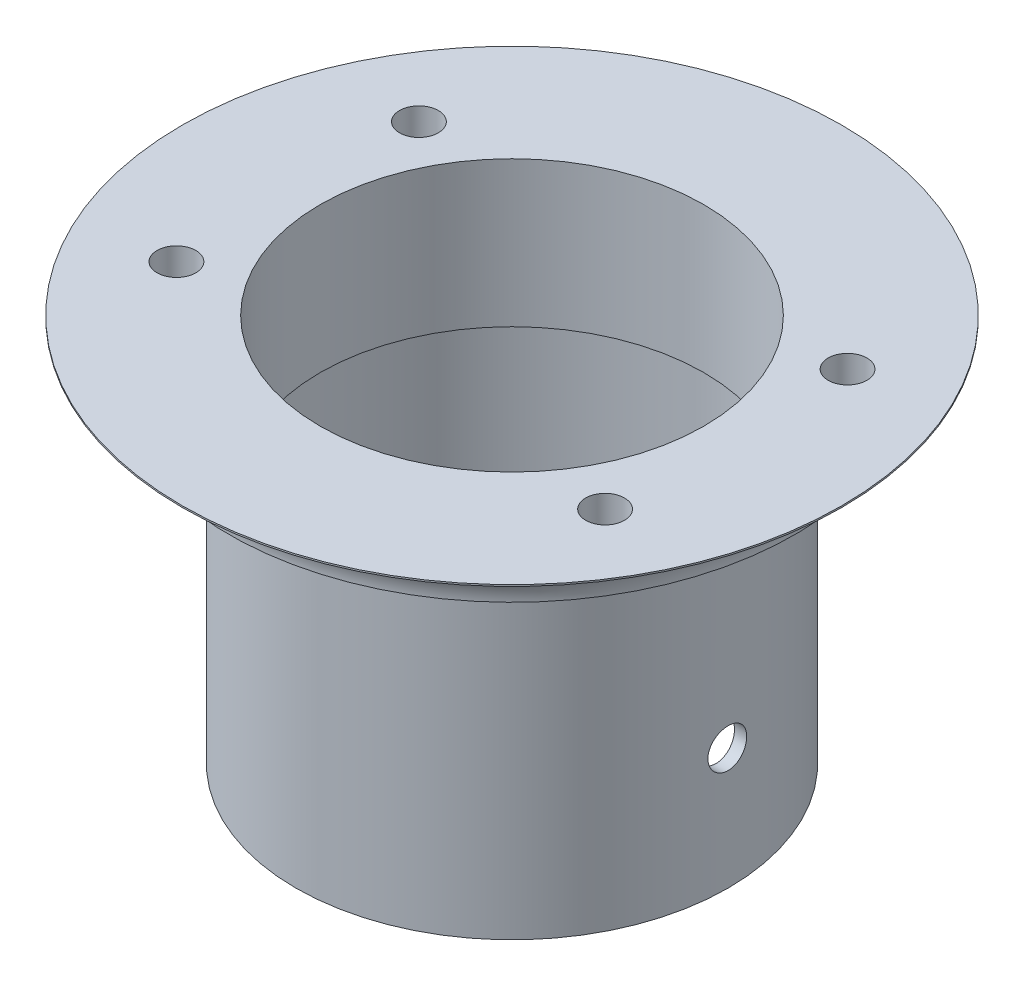
ISO-10303-21;
HEADER;
FILE_DESCRIPTION(('STEP AP214'),'2;1');
FILE_NAME('part.step','',(''),(''),'','','');
FILE_SCHEMA(('AUTOMOTIVE_DESIGN { 1 0 10303 214 1 1 1 1 }'));
ENDSEC;
DATA;
#1=APPLICATION_CONTEXT('core data for automotive mechanical design processes');
#2=APPLICATION_PROTOCOL_DEFINITION('international standard','automotive_design',2000,#1);
#3=PRODUCT_CONTEXT('',#1,'mechanical');
#4=PRODUCT('Part','Part','',(#3));
#5=PRODUCT_RELATED_PRODUCT_CATEGORY('part','',(#4));
#6=PRODUCT_DEFINITION_FORMATION('','',#4);
#7=PRODUCT_DEFINITION_CONTEXT('part definition',#1,'design');
#8=PRODUCT_DEFINITION('design','',#6,#7);
#9=PRODUCT_DEFINITION_SHAPE('','',#8);
#10=(LENGTH_UNIT() NAMED_UNIT(*) SI_UNIT(.MILLI.,.METRE.));
#11=(NAMED_UNIT(*) PLANE_ANGLE_UNIT() SI_UNIT($,.RADIAN.));
#12=(NAMED_UNIT(*) SI_UNIT($,.STERADIAN.) SOLID_ANGLE_UNIT());
#13=UNCERTAINTY_MEASURE_WITH_UNIT(LENGTH_MEASURE(1.E-05),#10,'distance_accuracy_value','');
#14=(GEOMETRIC_REPRESENTATION_CONTEXT(3) GLOBAL_UNCERTAINTY_ASSIGNED_CONTEXT((#13)) GLOBAL_UNIT_ASSIGNED_CONTEXT((#10,
#11,#12)) REPRESENTATION_CONTEXT('',''));
#15=CARTESIAN_POINT('',(0.,0.,0.));
#16=DIRECTION('',(0.,0.,1.));
#17=DIRECTION('',(1.,0.,0.));
#18=AXIS2_PLACEMENT_3D('',#15,#16,#17);
#19=CARTESIAN_POINT('',(0.,-30.,0.));
#20=DIRECTION('',(0.,1.,0.));
#21=DIRECTION('',(0.,0.,1.));
#22=AXIS2_PLACEMENT_3D('',#19,#20,#21);
#23=CYLINDRICAL_SURFACE('',#22,22.2871926);
#24=CARTESIAN_POINT('',(0.,-30.,0.));
#25=DIRECTION('',(0.,-1.,0.));
#26=DIRECTION('',(0.,0.,-1.));
#27=AXIS2_PLACEMENT_3D('',#24,#25,#26);
#28=CIRCLE('',#27,22.2871926);
#29=CARTESIAN_POINT('',(0.,-30.,-22.2871926));
#30=VERTEX_POINT('',#29);
#31=EDGE_CURVE('E180',#30,#30,#28,.T.);
#32=ORIENTED_EDGE('',*,*,#31,.F.);
#33=EDGE_LOOP('',(#32));
#34=FACE_BOUND('',#33,.T.);
#35=CARTESIAN_POINT('',(0.,5.,0.));
#36=DIRECTION('',(0.,-1.,0.));
#37=DIRECTION('',(0.,0.,-1.));
#38=AXIS2_PLACEMENT_3D('',#35,#36,#37);
#39=CIRCLE('',#38,22.2871926);
#40=CARTESIAN_POINT('',(0.,5.,-22.2871926));
#41=VERTEX_POINT('',#40);
#42=EDGE_CURVE('E178',#41,#41,#39,.T.);
#43=ORIENTED_EDGE('',*,*,#42,.T.);
#44=EDGE_LOOP('',(#43));
#45=FACE_BOUND('',#44,.T.);
#46=CARTESIAN_POINT('',(-22.1972735710829,-17.5,2.));
#47=CARTESIAN_POINT('',(-22.1972747578384,-17.3879020512167,1.99999511742206));
#48=CARTESIAN_POINT('',(-22.1981318713445,-17.2757285837097,1.990543818689));
#49=CARTESIAN_POINT('',(-22.2014675221558,-17.0544876457277,1.95298122193684));
#50=CARTESIAN_POINT('',(-22.2039478783657,-16.9454238029419,1.92484899070827));
#51=CARTESIAN_POINT('',(-22.210246844414,-16.7336383045393,1.85074673635096));
#52=CARTESIAN_POINT('',(-22.2140646763531,-16.6309130030744,1.80478708030251));
#53=CARTESIAN_POINT('',(-22.2226074531708,-16.4346584040803,1.69635359363768));
#54=CARTESIAN_POINT('',(-22.2273322090682,-16.3411271968517,1.63388320244132));
#55=CARTESIAN_POINT('',(-22.2371721337219,-16.1656157733296,1.49400257964118));
#56=CARTESIAN_POINT('',(-22.2422882941835,-16.0836665040397,1.41655358427252));
#57=CARTESIAN_POINT('',(-22.2523255157385,-15.9339113047724,1.24899661663564));
#58=CARTESIAN_POINT('',(-22.2572465681556,-15.8661060031876,1.15888808222299));
#59=CARTESIAN_POINT('',(-22.2663486688275,-15.7464588426304,0.968383200456268));
#60=CARTESIAN_POINT('',(-22.2705284588251,-15.6946440184637,0.867969808575251));
#61=CARTESIAN_POINT('',(-22.2776663557045,-15.6086215750189,0.659824263836168));
#62=CARTESIAN_POINT('',(-22.2806244870105,-15.5744136037322,0.552092257345804));
#63=CARTESIAN_POINT('',(-22.2849788219677,-15.5246656964799,0.332677649173628));
#64=CARTESIAN_POINT('',(-22.2863792415886,-15.5090753631355,0.221006559086607));
#65=CARTESIAN_POINT('',(-22.2874746715091,-15.4968494362648,-0.00337546761511194));
#66=CARTESIAN_POINT('',(-22.287169718065,-15.5002134397689,-0.116086382072265));
#67=CARTESIAN_POINT('',(-22.2848922298026,-15.5257595912184,-0.339006741680385));
#68=CARTESIAN_POINT('',(-22.2829244974277,-15.5478875457025,-0.449222453174857));
#69=CARTESIAN_POINT('',(-22.2775482296399,-15.610249143337,-0.664369168517822));
#70=CARTESIAN_POINT('',(-22.2741396786775,-15.6504829818884,-0.769300115318883));
#71=CARTESIAN_POINT('',(-22.2662568836501,-15.7479743009695,-0.971070558621091));
#72=CARTESIAN_POINT('',(-22.2617811285953,-15.8052559472581,-1.06789831730319));
#73=CARTESIAN_POINT('',(-22.252266629674,-15.9351993205307,-1.25058570005471));
#74=CARTESIAN_POINT('',(-22.2472278725395,-16.007861410018,-1.33644506553247));
#75=CARTESIAN_POINT('',(-22.2371323841951,-16.1668082616334,-1.49507549578169));
#76=CARTESIAN_POINT('',(-22.2320756522269,-16.2531401337092,-1.56779936485415));
#77=CARTESIAN_POINT('',(-22.2225319486924,-16.4368120352031,-1.69772953841518));
#78=CARTESIAN_POINT('',(-22.2180449777122,-16.534152075942,-1.75493582694544));
#79=CARTESIAN_POINT('',(-22.2101481626183,-16.7371114626717,-1.8522057349068));
#80=CARTESIAN_POINT('',(-22.2067384830431,-16.8427320703104,-1.89226673600946));
#81=CARTESIAN_POINT('',(-22.2013856168003,-17.0592378347672,-1.95407307096022));
#82=CARTESIAN_POINT('',(-22.1994423943012,-17.1701228628838,-1.9758188523247));
#83=CARTESIAN_POINT('',(-22.1972484360612,-17.3935963785479,-2.00031736919359));
#84=CARTESIAN_POINT('',(-22.1969918287129,-17.5061775873995,-2.0031359964759));
#85=CARTESIAN_POINT('',(-22.1981846600312,-17.7302108347709,-1.98987295841871));
#86=CARTESIAN_POINT('',(-22.1996340802026,-17.8416628855188,-1.97379149797679));
#87=CARTESIAN_POINT('',(-22.2040703057082,-18.0600838864496,-1.92323978146857));
#88=CARTESIAN_POINT('',(-22.2070545275864,-18.1670600445093,-1.8888004228082));
#89=CARTESIAN_POINT('',(-22.2142219880295,-18.373716157008,-1.80254197486507));
#90=CARTESIAN_POINT('',(-22.2184052488387,-18.4733959760435,-1.75072256314742));
#91=CARTESIAN_POINT('',(-22.2275136706671,-18.6629309614522,-1.63100884413622));
#92=CARTESIAN_POINT('',(-22.2324408405437,-18.7527583523376,-1.56307071688197));
#93=CARTESIAN_POINT('',(-22.2424752044135,-18.9197575483548,-1.41311119297579));
#94=CARTESIAN_POINT('',(-22.2475824019941,-18.9969291011184,-1.3310895155527));
#95=CARTESIAN_POINT('',(-22.2574189441875,-19.1366517562085,-1.15500604030694));
#96=CARTESIAN_POINT('',(-22.2621471547689,-19.1991599837973,-1.06091014917612));
#97=CARTESIAN_POINT('',(-22.2706765810179,-19.3074871213661,-0.863518617980246));
#98=CARTESIAN_POINT('',(-22.274477807211,-19.3533062208453,-0.760223082390513));
#99=CARTESIAN_POINT('',(-22.2807197891287,-19.426881190768,-0.547516632091038));
#100=CARTESIAN_POINT('',(-22.2831625240799,-19.4546633497061,-0.438114870976029));
#101=CARTESIAN_POINT('',(-22.2864203628508,-19.4914616807736,-0.216176534935299));
#102=CARTESIAN_POINT('',(-22.2872355028901,-19.5004782705009,-0.103640029824807));
#103=CARTESIAN_POINT('',(-22.2871463372315,-19.4994842888056,0.120951224744838));
#104=CARTESIAN_POINT('',(-22.2862480611426,-19.48954044029,0.233006277913691));
#105=CARTESIAN_POINT('',(-22.2828449011884,-19.4510472730307,0.45384776307801));
#106=CARTESIAN_POINT('',(-22.2803400154438,-19.4224979325236,0.562634191249939));
#107=CARTESIAN_POINT('',(-22.274004533651,-19.3476217264594,0.773852904445489));
#108=CARTESIAN_POINT('',(-22.2701740481596,-19.3012963434146,0.876285718529785));
#109=CARTESIAN_POINT('',(-22.2616153388955,-19.1921904605281,1.07193140249992));
#110=CARTESIAN_POINT('',(-22.256887126052,-19.129410161012,1.16514438461093));
#111=CARTESIAN_POINT('',(-22.2470434449778,-18.9889259780871,1.34004620070505));
#112=CARTESIAN_POINT('',(-22.2419267265873,-18.9111725638661,1.42169518049074));
#113=CARTESIAN_POINT('',(-22.2318933661685,-18.7430425132889,1.57081920110572));
#114=CARTESIAN_POINT('',(-22.2269767727254,-18.6526628349345,1.63829081639756));
#115=CARTESIAN_POINT('',(-22.2178891383573,-18.4616431759549,1.75725187507409));
#116=CARTESIAN_POINT('',(-22.2137196945828,-18.3609819208149,1.80870725014414));
#117=CARTESIAN_POINT('',(-22.2066177291929,-18.1524779785493,1.89391873429749));
#118=CARTESIAN_POINT('',(-22.2036837959954,-18.0446436507977,1.92769505264626));
#119=CARTESIAN_POINT('',(-22.200134296723,-17.8634851937361,1.96805217594431));
#120=CARTESIAN_POINT('',(-22.1990665072282,-17.7913237712847,1.98001652304328));
#121=CARTESIAN_POINT('',(-22.1976357587225,-17.6461189281544,1.99599201375689));
#122=CARTESIAN_POINT('',(-22.197272797449,-17.5730755103078,2.00000318290279));
#123=CARTESIAN_POINT('',(-22.1972735710829,-17.5,2.));
#124=B_SPLINE_CURVE_WITH_KNOTS('',3,(#46,#47,#48,#49,#50,#51,#52,#53,#54,#55,#56,#57,#58,#59,
#60,#61,#62,#63,#64,#65,#66,#67,#68,#69,#70,#71,#72,#73,#74,#75,#76,#77,#78,#79,#80,#81,#82,#83,
#84,#85,#86,#87,#88,#89,#90,#91,#92,#93,#94,#95,#96,#97,#98,#99,#100,#101,#102,#103,#104,#105,
#106,#107,#108,#109,#110,#111,#112,#113,#114,#115,#116,#117,#118,#119,#120,#121,#122,#123),
.UNSPECIFIED.,.T.,.F.,(4,2,2,2,2,2,2,2,2,2,2,2,2,2,2,2,2,2,2,2,2,2,2,2,2,2,2,2,2,2,2,2,2,2,2,2,
2,2,4),(0.,0.336027017428784,0.672431212005177,1.0086400719516,1.34477894995673,
1.68179966672602,2.01883535356938,2.35643777760467,2.69403345178983,3.03071317808978,
3.36738574659989,3.70308924674595,4.03879636993308,4.37498165278979,4.71117486011394,
5.04855296639092,5.38593141962668,5.72336137696629,6.06078308926081,6.39702951152464,
6.73327228854404,7.06895092809568,7.40463579550451,7.74124392135057,8.07785875863146,
8.41544590096337,8.75302920999183,9.09011938664503,9.42720206181135,9.76310071191314,
10.0989997549234,10.4348707902195,10.7707377367398,11.1077354274279,11.4448144501676,
11.7826056533358,12.1200098729808,12.3390631640554,12.5581157519247),.UNSPECIFIED.);
#125=CARTESIAN_POINT('',(-22.1972735710829,-17.5,2.));
#126=VERTEX_POINT('',#125);
#127=EDGE_CURVE('E93',#126,#126,#124,.T.);
#128=ORIENTED_EDGE('',*,*,#127,.F.);
#129=EDGE_LOOP('',(#128));
#130=FACE_BOUND('',#129,.T.);
#131=CARTESIAN_POINT('',(22.1972735710829,-17.5,2.));
#132=CARTESIAN_POINT('',(22.1972747578384,-17.6120979487833,1.99999511742206));
#133=CARTESIAN_POINT('',(22.1981318713445,-17.7242714162903,1.990543818689));
#134=CARTESIAN_POINT('',(22.2014675221558,-17.9455123542723,1.95298122193684));
#135=CARTESIAN_POINT('',(22.2039478783657,-18.0545761970581,1.92484899070827));
#136=CARTESIAN_POINT('',(22.210246844414,-18.2663616954607,1.85074673635096));
#137=CARTESIAN_POINT('',(22.2140646763531,-18.3690869969256,1.80478708030251));
#138=CARTESIAN_POINT('',(22.2226074531708,-18.5653415959197,1.69635359363768));
#139=CARTESIAN_POINT('',(22.2273322090682,-18.6588728031483,1.63388320244132));
#140=CARTESIAN_POINT('',(22.2371721337219,-18.8343842266704,1.49400257964118));
#141=CARTESIAN_POINT('',(22.2422882941835,-18.9163334959603,1.41655358427252));
#142=CARTESIAN_POINT('',(22.2523255157385,-19.0660886952276,1.24899661663564));
#143=CARTESIAN_POINT('',(22.2572465681556,-19.1338939968124,1.15888808222299));
#144=CARTESIAN_POINT('',(22.2663486688275,-19.2535411573696,0.968383200456268));
#145=CARTESIAN_POINT('',(22.2705284588251,-19.3053559815363,0.867969808575251));
#146=CARTESIAN_POINT('',(22.2776663557045,-19.3913784249811,0.659824263836168));
#147=CARTESIAN_POINT('',(22.2806244870105,-19.4255863962679,0.552092257345804));
#148=CARTESIAN_POINT('',(22.2849788219677,-19.4753343035201,0.332677649173627));
#149=CARTESIAN_POINT('',(22.2863792415886,-19.4909246368645,0.221006559086607));
#150=CARTESIAN_POINT('',(22.2874746715091,-19.5031505637352,-0.00337546761511175));
#151=CARTESIAN_POINT('',(22.287169718065,-19.4997865602311,-0.116086382072265));
#152=CARTESIAN_POINT('',(22.2848922298026,-19.4742404087816,-0.339006741680384));
#153=CARTESIAN_POINT('',(22.2829244974277,-19.4521124542975,-0.449222453174857));
#154=CARTESIAN_POINT('',(22.2775482296399,-19.389750856663,-0.664369168517822));
#155=CARTESIAN_POINT('',(22.2741396786775,-19.3495170181116,-0.769300115318883));
#156=CARTESIAN_POINT('',(22.2662568836501,-19.2520256990305,-0.971070558621091));
#157=CARTESIAN_POINT('',(22.2617811285953,-19.1947440527419,-1.06789831730319));
#158=CARTESIAN_POINT('',(22.252266629674,-19.0648006794693,-1.25058570005471));
#159=CARTESIAN_POINT('',(22.2472278725395,-18.992138589982,-1.33644506553247));
#160=CARTESIAN_POINT('',(22.2371323841951,-18.8331917383666,-1.49507549578169));
#161=CARTESIAN_POINT('',(22.2320756522269,-18.7468598662908,-1.56779936485415));
#162=CARTESIAN_POINT('',(22.2225319486924,-18.5631879647969,-1.69772953841518));
#163=CARTESIAN_POINT('',(22.2180449777122,-18.465847924058,-1.75493582694544));
#164=CARTESIAN_POINT('',(22.2101481626183,-18.2628885373283,-1.8522057349068));
#165=CARTESIAN_POINT('',(22.2067384830431,-18.1572679296896,-1.89226673600946));
#166=CARTESIAN_POINT('',(22.2013856168003,-17.9407621652328,-1.95407307096022));
#167=CARTESIAN_POINT('',(22.1994423943012,-17.8298771371162,-1.9758188523247));
#168=CARTESIAN_POINT('',(22.1972484360612,-17.6064036214521,-2.00031736919359));
#169=CARTESIAN_POINT('',(22.1969918287129,-17.4938224126005,-2.0031359964759));
#170=CARTESIAN_POINT('',(22.1981846600312,-17.2697891652291,-1.98987295841871));
#171=CARTESIAN_POINT('',(22.1996340802026,-17.1583371144812,-1.97379149797679));
#172=CARTESIAN_POINT('',(22.2040703057082,-16.9399161135504,-1.92323978146857));
#173=CARTESIAN_POINT('',(22.2070545275864,-16.8329399554907,-1.8888004228082));
#174=CARTESIAN_POINT('',(22.2142219880295,-16.626283842992,-1.80254197486507));
#175=CARTESIAN_POINT('',(22.2184052488387,-16.5266040239565,-1.75072256314742));
#176=CARTESIAN_POINT('',(22.2275136706671,-16.3370690385478,-1.63100884413621));
#177=CARTESIAN_POINT('',(22.2324408405437,-16.2472416476624,-1.56307071688197));
#178=CARTESIAN_POINT('',(22.2424752044135,-16.0802424516452,-1.41311119297579));
#179=CARTESIAN_POINT('',(22.2475824019941,-16.0030708988816,-1.3310895155527));
#180=CARTESIAN_POINT('',(22.2574189441875,-15.8633482437915,-1.15500604030694));
#181=CARTESIAN_POINT('',(22.2621471547689,-15.8008400162027,-1.06091014917612));
#182=CARTESIAN_POINT('',(22.2706765810179,-15.6925128786339,-0.863518617980248));
#183=CARTESIAN_POINT('',(22.274477807211,-15.6466937791547,-0.760223082390515));
#184=CARTESIAN_POINT('',(22.2807197891287,-15.573118809232,-0.54751663209104));
#185=CARTESIAN_POINT('',(22.2831625240799,-15.5453366502939,-0.43811487097603));
#186=CARTESIAN_POINT('',(22.2864203628508,-15.5085383192264,-0.2161765349353));
#187=CARTESIAN_POINT('',(22.2872355028901,-15.4995217294991,-0.103640029824807));
#188=CARTESIAN_POINT('',(22.2871463372315,-15.5005157111944,0.120951224744839));
#189=CARTESIAN_POINT('',(22.2862480611426,-15.51045955971,0.233006277913691));
#190=CARTESIAN_POINT('',(22.2828449011884,-15.5489527269693,0.45384776307801));
#191=CARTESIAN_POINT('',(22.2803400154438,-15.5775020674764,0.56263419124994));
#192=CARTESIAN_POINT('',(22.274004533651,-15.6523782735406,0.773852904445491));
#193=CARTESIAN_POINT('',(22.2701740481596,-15.6987036565854,0.876285718529788));
#194=CARTESIAN_POINT('',(22.2616153388955,-15.8078095394719,1.07193140249992));
#195=CARTESIAN_POINT('',(22.256887126052,-15.870589838988,1.16514438461093));
#196=CARTESIAN_POINT('',(22.2470434449778,-16.0110740219129,1.34004620070505));
#197=CARTESIAN_POINT('',(22.2419267265873,-16.0888274361339,1.42169518049073));
#198=CARTESIAN_POINT('',(22.2318933661685,-16.2569574867111,1.57081920110572));
#199=CARTESIAN_POINT('',(22.2269767727254,-16.3473371650655,1.63829081639756));
#200=CARTESIAN_POINT('',(22.2178891383573,-16.5383568240451,1.75725187507409));
#201=CARTESIAN_POINT('',(22.2137196945828,-16.6390180791851,1.80870725014414));
#202=CARTESIAN_POINT('',(22.2066177291929,-16.8475220214507,1.89391873429749));
#203=CARTESIAN_POINT('',(22.2036837959954,-16.9553563492023,1.92769505264626));
#204=CARTESIAN_POINT('',(22.200134296723,-17.1365148062639,1.96805217594431));
#205=CARTESIAN_POINT('',(22.1990665072282,-17.2086762287153,1.98001652304328));
#206=CARTESIAN_POINT('',(22.1976357587225,-17.3538810718456,1.99599201375689));
#207=CARTESIAN_POINT('',(22.197272797449,-17.4269244896922,2.00000318290279));
#208=CARTESIAN_POINT('',(22.1972735710829,-17.5,2.));
#209=B_SPLINE_CURVE_WITH_KNOTS('',3,(#131,#132,#133,#134,#135,#136,#137,#138,#139,#140,#141,
#142,#143,#144,#145,#146,#147,#148,#149,#150,#151,#152,#153,#154,#155,#156,#157,#158,#159,#160,
#161,#162,#163,#164,#165,#166,#167,#168,#169,#170,#171,#172,#173,#174,#175,#176,#177,#178,#179,
#180,#181,#182,#183,#184,#185,#186,#187,#188,#189,#190,#191,#192,#193,#194,#195,#196,#197,#198,
#199,#200,#201,#202,#203,#204,#205,#206,#207,#208),.UNSPECIFIED.,.T.,.F.,(4,2,2,2,2,2,2,2,2,2,2,
2,2,2,2,2,2,2,2,2,2,2,2,2,2,2,2,2,2,2,2,2,2,2,2,2,2,2,4),(0.,0.336027017428784,
0.672431212005177,1.0086400719516,1.34477894995673,1.68179966672602,2.01883535356938,
2.35643777760467,2.69403345178983,3.03071317808978,3.36738574659989,3.70308924674595,
4.03879636993308,4.37498165278979,4.71117486011394,5.04855296639092,5.38593141962668,
5.72336137696629,6.06078308926081,6.39702951152464,6.73327228854404,7.06895092809568,
7.40463579550451,7.74124392135057,8.07785875863146,8.41544590096337,8.75302920999183,
9.09011938664503,9.42720206181136,9.76310071191314,10.0989997549234,10.4348707902195,
10.7707377367398,11.1077354274279,11.4448144501676,11.7826056533358,12.1200098729808,
12.3390631640555,12.5581157519247),.UNSPECIFIED.);
#210=CARTESIAN_POINT('',(22.1972735710829,-17.5,2.));
#211=VERTEX_POINT('',#210);
#212=EDGE_CURVE('E100',#211,#211,#209,.T.);
#213=ORIENTED_EDGE('',*,*,#212,.F.);
#214=EDGE_LOOP('',(#213));
#215=FACE_BOUND('',#214,.T.);
#216=ADVANCED_FACE('F43',(#34,#45,#130,#215),#23,.T.);
#217=CARTESIAN_POINT('',(0.,-5.,0.));
#218=DIRECTION('',(0.,-1.,0.));
#219=DIRECTION('',(0.,0.,-1.));
#220=AXIS2_PLACEMENT_3D('',#217,#218,#219);
#221=CYLINDRICAL_SURFACE('',#220,21.0371926);
#222=CARTESIAN_POINT('',(0.,-5.,0.));
#223=DIRECTION('',(0.,-1.,0.));
#224=DIRECTION('',(0.,0.,-1.));
#225=AXIS2_PLACEMENT_3D('',#222,#223,#224);
#226=CIRCLE('',#225,21.0371926);
#227=CARTESIAN_POINT('',(0.,-5.,-21.0371926));
#228=VERTEX_POINT('',#227);
#229=EDGE_CURVE('E172',#228,#228,#226,.T.);
#230=ORIENTED_EDGE('',*,*,#229,.F.);
#231=EDGE_LOOP('',(#230));
#232=FACE_BOUND('',#231,.T.);
#233=CARTESIAN_POINT('',(0.,-30.,0.));
#234=DIRECTION('',(0.,-1.,0.));
#235=DIRECTION('',(0.,0.,-1.));
#236=AXIS2_PLACEMENT_3D('',#233,#234,#235);
#237=CIRCLE('',#236,21.0371926);
#238=CARTESIAN_POINT('',(0.,-30.,-21.0371926));
#239=VERTEX_POINT('',#238);
#240=EDGE_CURVE('E168',#239,#239,#237,.T.);
#241=ORIENTED_EDGE('',*,*,#240,.T.);
#242=EDGE_LOOP('',(#241));
#243=FACE_BOUND('',#242,.T.);
#244=CARTESIAN_POINT('',(-20.9419070881688,-17.5,2.));
#245=CARTESIAN_POINT('',(-20.9419083413363,-17.6120681851692,1.99999513201458));
#246=CARTESIAN_POINT('',(-20.9428163597082,-17.7242111611602,1.99054882838601));
#247=CARTESIAN_POINT('',(-20.9463499676321,-17.945389909875,1.95300723820345));
#248=CARTESIAN_POINT('',(-20.9489774667533,-18.0544220872463,1.92489121748735));
#249=CARTESIAN_POINT('',(-20.9556497833662,-18.2661440846311,1.85083454002998));
#250=CARTESIAN_POINT('',(-20.9596937590213,-18.3688376292584,1.80490446875215));
#251=CARTESIAN_POINT('',(-20.9687423332486,-18.5650349564377,1.69654334919544));
#252=CARTESIAN_POINT('',(-20.9737467363954,-18.6585406026769,1.63411565683704));
#253=CARTESIAN_POINT('',(-20.9841708053427,-18.8340393112503,1.49430974200621));
#254=CARTESIAN_POINT('',(-20.9895916457219,-18.9159978133087,1.4168882193762));
#255=CARTESIAN_POINT('',(-21.0002271079792,-19.0657783354441,1.24938464715165));
#256=CARTESIAN_POINT('',(-21.0054417205491,-19.1335997180128,1.15930202691602));
#257=CARTESIAN_POINT('',(-21.0150886553621,-19.2532990372019,0.96882317260842));
#258=CARTESIAN_POINT('',(-21.0195194791809,-19.3051465728206,0.868407751815735));
#259=CARTESIAN_POINT('',(-21.0270868551762,-19.3912319623651,0.660247122460795));
#260=CARTESIAN_POINT('',(-21.0302234360967,-19.4254702073817,0.552502076744866));
#261=CARTESIAN_POINT('',(-21.0348406839719,-19.4752642664909,0.333088507012158));
#262=CARTESIAN_POINT('',(-21.0363263611574,-19.4908766178924,0.221432920762996));
#263=CARTESIAN_POINT('',(-21.0374914281367,-19.503150598913,-0.0029229863359404));
#264=CARTESIAN_POINT('',(-21.0371708606019,-19.49981267622,-0.115623282442325));
#265=CARTESIAN_POINT('',(-21.0347636682501,-19.474326862005,-0.338485800052365));
#266=CARTESIAN_POINT('',(-21.0326827515386,-19.4522397657246,-0.448655044151482));
#267=CARTESIAN_POINT('',(-21.0269953428753,-19.3899772304994,-0.663715646732794));
#268=CARTESIAN_POINT('',(-21.0233888327512,-19.3498015760904,-0.768606942329427));
#269=CARTESIAN_POINT('',(-21.0150459731244,-19.2524353593934,-0.970326378206366));
#270=CARTESIAN_POINT('',(-21.010307832801,-19.1952177922147,-1.06714140666164));
#271=CARTESIAN_POINT('',(-21.0002336264524,-19.0654115543207,-1.24981700137036));
#272=CARTESIAN_POINT('',(-20.9948975445921,-18.9928224764821,-1.33567727738439));
#273=CARTESIAN_POINT('',(-20.9842016341831,-18.8339916104411,-1.4943619999207));
#274=CARTESIAN_POINT('',(-20.9788417951928,-18.7476969545077,-1.56713353968094));
#275=CARTESIAN_POINT('',(-20.9687235713229,-18.5640881151839,-1.69716574064731));
#276=CARTESIAN_POINT('',(-20.9639651871842,-18.4667739182192,-1.75442638274627));
#277=CARTESIAN_POINT('',(-20.9555880675547,-18.2638488352008,-1.85181055977301));
#278=CARTESIAN_POINT('',(-20.9519695385038,-18.158236450579,-1.89193099089337));
#279=CARTESIAN_POINT('',(-20.9462860480425,-17.9417322842461,-1.95385485629721));
#280=CARTESIAN_POINT('',(-20.9442210439408,-17.8308406476993,-1.97565879392502));
#281=CARTESIAN_POINT('',(-20.941885669953,-17.6073897741459,-2.000263022369));
#282=CARTESIAN_POINT('',(-20.9416083173673,-17.4948387488602,-2.00313725498146));
#283=CARTESIAN_POINT('',(-20.9428612226345,-17.2708566069534,-1.9899945151607));
#284=CARTESIAN_POINT('',(-20.9443914584512,-17.1594254766963,-1.97397777302668));
#285=CARTESIAN_POINT('',(-20.9490807654374,-16.9410607499501,-1.92356953450101));
#286=CARTESIAN_POINT('',(-20.9522367496572,-16.8341190437223,-1.88921285727139));
#287=CARTESIAN_POINT('',(-20.9598194337728,-16.6275170365796,-1.80313550801036));
#288=CARTESIAN_POINT('',(-20.9642461600532,-16.5278568869064,-1.75141447543752));
#289=CARTESIAN_POINT('',(-20.9738884617107,-16.33830952917,-1.63189076577129));
#290=CARTESIAN_POINT('',(-20.9791064268696,-16.2484533961032,-1.56403900397166));
#291=CARTESIAN_POINT('',(-20.9897353736042,-16.0813795479059,-1.41425042003071));
#292=CARTESIAN_POINT('',(-20.9951463594961,-16.0041621156109,-1.33231328276353));
#293=CARTESIAN_POINT('',(-21.0055726573487,-15.8643034173128,-1.15635945804997));
#294=CARTESIAN_POINT('',(-21.0105866265807,-15.8017103266793,-1.06230438731366));
#295=CARTESIAN_POINT('',(-21.0196344691152,-15.6932083061395,-0.864974681594338));
#296=CARTESIAN_POINT('',(-21.0236683547174,-15.6472991668523,-0.76170016233414));
#297=CARTESIAN_POINT('',(-21.0302954222428,-15.5735502183128,-0.549032710882787));
#298=CARTESIAN_POINT('',(-21.0328909405232,-15.5456810939977,-0.43965002034241));
#299=CARTESIAN_POINT('',(-21.036358385484,-15.5087075598462,-0.217731988173247));
#300=CARTESIAN_POINT('',(-21.0372303556203,-15.4996026769057,-0.105196726102971));
#301=CARTESIAN_POINT('',(-21.0371524633343,-15.500422367701,0.119358272151501));
#302=CARTESIAN_POINT('',(-21.036209769555,-15.510272063278,0.231378291704009));
#303=CARTESIAN_POINT('',(-21.032622620045,-15.548564572215,0.452164928779333));
#304=CARTESIAN_POINT('',(-21.0299781626406,-15.5770074038603,0.560931543102491));
#305=CARTESIAN_POINT('',(-21.0232839019727,-15.6516585723344,0.7721249751765));
#306=CARTESIAN_POINT('',(-21.0192342516889,-15.6978649753473,0.874552481620244));
#307=CARTESIAN_POINT('',(-21.0101815361042,-15.8067235324959,1.07020932911492));
#308=CARTESIAN_POINT('',(-21.0051784793486,-15.8693755392317,1.16343875259687));
#309=CARTESIAN_POINT('',(-20.9947561577702,-16.0096279002007,1.33843667428401));
#310=CARTESIAN_POINT('',(-20.989335389176,-16.0872839401451,1.42016045408163));
#311=CARTESIAN_POINT('',(-20.9787013696893,-16.2552323954589,1.56945165676847));
#312=CARTESIAN_POINT('',(-20.973488169047,-16.3455278470974,1.63701566839741));
#313=CARTESIAN_POINT('',(-20.9638465034378,-16.5364189215892,1.75619086826012));
#314=CARTESIAN_POINT('',(-20.9594198943952,-16.6370380437217,1.8077645359426));
#315=CARTESIAN_POINT('',(-20.9518748595645,-16.8454844514405,1.89321669469507));
#316=CARTESIAN_POINT('',(-20.9487549500505,-16.9533033995562,1.9271152661882));
#317=CARTESIAN_POINT('',(-20.9449682805242,-17.1347842200757,1.96774478678936));
#318=CARTESIAN_POINT('',(-20.9438257141166,-17.2072835705456,1.97982410417126));
#319=CARTESIAN_POINT('',(-20.9422947087958,-17.3531779139698,1.99595329067948));
#320=CARTESIAN_POINT('',(-20.9419062670932,-17.4265729036103,2.00000318950498));
#321=CARTESIAN_POINT('',(-20.9419070881688,-17.5,2.));
#322=B_SPLINE_CURVE_WITH_KNOTS('',3,(#244,#245,#246,#247,#248,#249,#250,#251,#252,#253,#254,
#255,#256,#257,#258,#259,#260,#261,#262,#263,#264,#265,#266,#267,#268,#269,#270,#271,#272,#273,
#274,#275,#276,#277,#278,#279,#280,#281,#282,#283,#284,#285,#286,#287,#288,#289,#290,#291,#292,
#293,#294,#295,#296,#297,#298,#299,#300,#301,#302,#303,#304,#305,#306,#307,#308,#309,#310,#311,
#312,#313,#314,#315,#316,#317,#318,#319,#320,#321),.UNSPECIFIED.,.T.,.F.,(4,2,2,2,2,2,2,2,2,2,2,
2,2,2,2,2,2,2,2,2,2,2,2,2,2,2,2,2,2,2,2,2,2,2,2,2,2,2,4),(0.,0.335936427677585,0.67224656407032,
1.00835716370642,1.34439944480395,1.68142704497219,2.01846983999266,2.35615017901219,
2.69382301804988,3.03046825077597,3.36710553050979,3.70265539642841,4.03820925940148,
4.37429770128889,4.71039504578437,5.04782182749956,5.3852490248734,5.72273729883339,
6.06021629818141,6.39637627648992,6.73253215672658,7.0680520885261,7.40357898725942,
7.74014024302407,8.07670902950457,8.41437137926937,8.75202949128174,9.08913752147559,
9.42623705203838,9.76200763801476,10.0977785542039,10.4335129273246,10.7692442914012,
11.1062464864328,11.4433297762989,11.7811981319475,12.1186817992274,12.3387882251211,
12.5588938368846),.UNSPECIFIED.);
#323=CARTESIAN_POINT('',(-20.9419070881688,-17.5,2.));
#324=VERTEX_POINT('',#323);
#325=EDGE_CURVE('E72',#324,#324,#322,.T.);
#326=ORIENTED_EDGE('',*,*,#325,.F.);
#327=EDGE_LOOP('',(#326));
#328=FACE_BOUND('',#327,.T.);
#329=CARTESIAN_POINT('',(20.9419070881688,-17.5,2.));
#330=CARTESIAN_POINT('',(20.9419083413363,-17.3879318148308,1.99999513201458));
#331=CARTESIAN_POINT('',(20.9428163597082,-17.2757888388398,1.99054882838601));
#332=CARTESIAN_POINT('',(20.9463499676321,-17.054610090125,1.95300723820345));
#333=CARTESIAN_POINT('',(20.9489774667533,-16.9455779127537,1.92489121748734));
#334=CARTESIAN_POINT('',(20.9556497833662,-16.7338559153689,1.85083454002998));
#335=CARTESIAN_POINT('',(20.9596937590213,-16.6311623707416,1.80490446875214));
#336=CARTESIAN_POINT('',(20.9687423332486,-16.4349650435623,1.69654334919543));
#337=CARTESIAN_POINT('',(20.9737467363954,-16.3414593973231,1.63411565683704));
#338=CARTESIAN_POINT('',(20.9841708053427,-16.1659606887497,1.49430974200621));
#339=CARTESIAN_POINT('',(20.9895916457219,-16.0840021866913,1.4168882193762));
#340=CARTESIAN_POINT('',(21.0002271079792,-15.9342216645559,1.24938464715165));
#341=CARTESIAN_POINT('',(21.0054417205491,-15.8664002819872,1.15930202691602));
#342=CARTESIAN_POINT('',(21.0150886553621,-15.7467009627981,0.96882317260842));
#343=CARTESIAN_POINT('',(21.0195194791809,-15.6948534271794,0.868407751815735));
#344=CARTESIAN_POINT('',(21.0270868551762,-15.6087680376349,0.660247122460796));
#345=CARTESIAN_POINT('',(21.0302234360967,-15.5745297926183,0.552502076744866));
#346=CARTESIAN_POINT('',(21.0348406839719,-15.5247357335091,0.333088507012159));
#347=CARTESIAN_POINT('',(21.0363263611574,-15.5091233821076,0.221432920762997));
#348=CARTESIAN_POINT('',(21.0374914281367,-15.496849401087,-0.00292298633593975));
#349=CARTESIAN_POINT('',(21.0371708606019,-15.50018732378,-0.115623282442324));
#350=CARTESIAN_POINT('',(21.0347636682501,-15.525673137995,-0.338485800052365));
#351=CARTESIAN_POINT('',(21.0326827515386,-15.5477602342755,-0.448655044151483));
#352=CARTESIAN_POINT('',(21.0269953428753,-15.6100227695006,-0.663715646732794));
#353=CARTESIAN_POINT('',(21.0233888327512,-15.6501984239096,-0.768606942329427));
#354=CARTESIAN_POINT('',(21.0150459731244,-15.7475646406066,-0.970326378206366));
#355=CARTESIAN_POINT('',(21.010307832801,-15.8047822077853,-1.06714140666164));
#356=CARTESIAN_POINT('',(21.0002336264524,-15.9345884456793,-1.24981700137036));
#357=CARTESIAN_POINT('',(20.9948975445921,-16.0071775235179,-1.33567727738439));
#358=CARTESIAN_POINT('',(20.9842016341831,-16.1660083895589,-1.4943619999207));
#359=CARTESIAN_POINT('',(20.9788417951928,-16.2523030454923,-1.56713353968094));
#360=CARTESIAN_POINT('',(20.9687235713229,-16.4359118848161,-1.69716574064731));
#361=CARTESIAN_POINT('',(20.9639651871842,-16.5332260817808,-1.75442638274627));
#362=CARTESIAN_POINT('',(20.9555880675547,-16.7361511647992,-1.85181055977301));
#363=CARTESIAN_POINT('',(20.9519695385038,-16.841763549421,-1.89193099089337));
#364=CARTESIAN_POINT('',(20.9462860480425,-17.0582677157539,-1.95385485629721));
#365=CARTESIAN_POINT('',(20.9442210439408,-17.1691593523007,-1.97565879392502));
#366=CARTESIAN_POINT('',(20.941885669953,-17.3926102258541,-2.000263022369));
#367=CARTESIAN_POINT('',(20.9416083173673,-17.5051612511398,-2.00313725498146));
#368=CARTESIAN_POINT('',(20.9428612226345,-17.7291433930467,-1.9899945151607));
#369=CARTESIAN_POINT('',(20.9443914584512,-17.8405745233037,-1.97397777302668));
#370=CARTESIAN_POINT('',(20.9490807654374,-18.0589392500499,-1.92356953450101));
#371=CARTESIAN_POINT('',(20.9522367496572,-18.1658809562777,-1.88921285727139));
#372=CARTESIAN_POINT('',(20.9598194337728,-18.3724829634204,-1.80313550801036));
#373=CARTESIAN_POINT('',(20.9642461600532,-18.4721431130936,-1.75141447543752));
#374=CARTESIAN_POINT('',(20.9738884617107,-18.66169047083,-1.63189076577129));
#375=CARTESIAN_POINT('',(20.9791064268696,-18.7515466038968,-1.56403900397166));
#376=CARTESIAN_POINT('',(20.9897353736042,-18.9186204520941,-1.41425042003071));
#377=CARTESIAN_POINT('',(20.9951463594961,-18.9958378843891,-1.33231328276353));
#378=CARTESIAN_POINT('',(21.0055726573487,-19.1356965826872,-1.15635945804997));
#379=CARTESIAN_POINT('',(21.0105866265807,-19.1982896733207,-1.06230438731365));
#380=CARTESIAN_POINT('',(21.0196344691152,-19.3067916938605,-0.864974681594337));
#381=CARTESIAN_POINT('',(21.0236683547174,-19.3527008331477,-0.76170016233414));
#382=CARTESIAN_POINT('',(21.0302954222428,-19.4264497816872,-0.549032710882787));
#383=CARTESIAN_POINT('',(21.0328909405232,-19.4543189060023,-0.439650020342409));
#384=CARTESIAN_POINT('',(21.036358385484,-19.4912924401538,-0.217731988173246));
#385=CARTESIAN_POINT('',(21.0372303556203,-19.5003973230943,-0.10519672610297));
#386=CARTESIAN_POINT('',(21.0371524633343,-19.499577632299,0.119358272151501));
#387=CARTESIAN_POINT('',(21.036209769555,-19.489727936722,0.231378291704009));
#388=CARTESIAN_POINT('',(21.032622620045,-19.451435427785,0.452164928779333));
#389=CARTESIAN_POINT('',(21.0299781626406,-19.4229925961397,0.560931543102492));
#390=CARTESIAN_POINT('',(21.0232839019727,-19.3483414276656,0.7721249751765));
#391=CARTESIAN_POINT('',(21.0192342516889,-19.3021350246527,0.874552481620243));
#392=CARTESIAN_POINT('',(21.0101815361042,-19.1932764675041,1.07020932911492));
#393=CARTESIAN_POINT('',(21.0051784793486,-19.1306244607683,1.16343875259687));
#394=CARTESIAN_POINT('',(20.9947561577702,-18.9903720997993,1.33843667428401));
#395=CARTESIAN_POINT('',(20.989335389176,-18.9127160598549,1.42016045408163));
#396=CARTESIAN_POINT('',(20.9787013696893,-18.7447676045411,1.56945165676847));
#397=CARTESIAN_POINT('',(20.973488169047,-18.6544721529026,1.63701566839741));
#398=CARTESIAN_POINT('',(20.9638465034378,-18.4635810784109,1.75619086826012));
#399=CARTESIAN_POINT('',(20.9594198943952,-18.3629619562783,1.8077645359426));
#400=CARTESIAN_POINT('',(20.9518748595645,-18.1545155485595,1.89321669469507));
#401=CARTESIAN_POINT('',(20.9487549500505,-18.0466966004438,1.9271152661882));
#402=CARTESIAN_POINT('',(20.9449682805242,-17.8652157799243,1.96774478678936));
#403=CARTESIAN_POINT('',(20.9438257141166,-17.7927164294544,1.97982410417126));
#404=CARTESIAN_POINT('',(20.9422947087958,-17.6468220860302,1.99595329067948));
#405=CARTESIAN_POINT('',(20.9419062670932,-17.5734270963897,2.00000318950498));
#406=CARTESIAN_POINT('',(20.9419070881688,-17.5,2.));
#407=B_SPLINE_CURVE_WITH_KNOTS('',3,(#329,#330,#331,#332,#333,#334,#335,#336,#337,#338,#339,
#340,#341,#342,#343,#344,#345,#346,#347,#348,#349,#350,#351,#352,#353,#354,#355,#356,#357,#358,
#359,#360,#361,#362,#363,#364,#365,#366,#367,#368,#369,#370,#371,#372,#373,#374,#375,#376,#377,
#378,#379,#380,#381,#382,#383,#384,#385,#386,#387,#388,#389,#390,#391,#392,#393,#394,#395,#396,
#397,#398,#399,#400,#401,#402,#403,#404,#405,#406),.UNSPECIFIED.,.T.,.F.,(4,2,2,2,2,2,2,2,2,2,2,
2,2,2,2,2,2,2,2,2,2,2,2,2,2,2,2,2,2,2,2,2,2,2,2,2,2,2,4),(0.,0.335936427677589,0.67224656407032,
1.00835716370643,1.34439944480395,1.68142704497219,2.01846983999266,2.35615017901219,
2.69382301804988,3.03046825077596,3.36710553050979,3.70265539642841,4.03820925940148,
4.37429770128889,4.71039504578437,5.04782182749957,5.38524902487341,5.72273729883339,
6.06021629818141,6.39637627648993,6.73253215672658,7.0680520885261,7.40357898725942,
7.74014024302407,8.07670902950458,8.41437137926937,8.75202949128174,9.08913752147559,
9.42623705203838,9.76200763801477,10.0977785542039,10.4335129273246,10.7692442914012,
11.1062464864328,11.4433297762989,11.7811981319475,12.1186817992274,12.3387882251211,
12.5588938368846),.UNSPECIFIED.);
#408=CARTESIAN_POINT('',(20.9419070881688,-17.5,2.));
#409=VERTEX_POINT('',#408);
#410=EDGE_CURVE('E47',#409,#409,#407,.T.);
#411=ORIENTED_EDGE('',*,*,#410,.F.);
#412=EDGE_LOOP('',(#411));
#413=FACE_BOUND('',#412,.T.);
#414=ADVANCED_FACE('F78',(#232,#243,#328,#413),#221,.F.);
#415=CARTESIAN_POINT('',(0.,10.,0.));
#416=DIRECTION('',(0.,-1.,0.));
#417=DIRECTION('',(0.,0.,-1.));
#418=AXIS2_PLACEMENT_3D('',#415,#416,#417);
#419=CYLINDRICAL_SURFACE('',#418,19.7871926);
#420=CARTESIAN_POINT('',(0.,10.,0.));
#421=DIRECTION('',(0.,-1.,0.));
#422=DIRECTION('',(0.,0.,-1.));
#423=AXIS2_PLACEMENT_3D('',#420,#421,#422);
#424=CIRCLE('',#423,19.7871926);
#425=CARTESIAN_POINT('',(0.,10.,-19.7871926));
#426=VERTEX_POINT('',#425);
#427=EDGE_CURVE('E57',#426,#426,#424,.T.);
#428=ORIENTED_EDGE('',*,*,#427,.F.);
#429=EDGE_LOOP('',(#428));
#430=FACE_BOUND('',#429,.T.);
#431=CARTESIAN_POINT('',(0.,-5.,0.));
#432=DIRECTION('',(0.,-1.,0.));
#433=DIRECTION('',(0.,0.,-1.));
#434=AXIS2_PLACEMENT_3D('',#431,#432,#433);
#435=CIRCLE('',#434,19.7871926);
#436=CARTESIAN_POINT('',(0.,-5.,-19.7871926));
#437=VERTEX_POINT('',#436);
#438=EDGE_CURVE('E165',#437,#437,#435,.T.);
#439=ORIENTED_EDGE('',*,*,#438,.T.);
#440=EDGE_LOOP('',(#439));
#441=FACE_BOUND('',#440,.T.);
#442=ADVANCED_FACE('F115',(#430,#441),#419,.F.);
#443=CARTESIAN_POINT('',(38.,5.,37.0821301775148));
#444=DIRECTION('',(0.,-1.,0.));
#445=DIRECTION('',(0.,0.,-1.));
#446=AXIS2_PLACEMENT_3D('',#443,#444,#445);
#447=PLANE('',#446);
#448=CARTESIAN_POINT('',(-22.1,5.,12.5));
#449=DIRECTION('',(0.,-1.,0.));
#450=DIRECTION('',(0.,0.,-1.));
#451=AXIS2_PLACEMENT_3D('',#448,#449,#450);
#452=CIRCLE('',#451,2.);
#453=CARTESIAN_POINT('',(-22.1,5.,10.5));
#454=VERTEX_POINT('',#453);
#455=EDGE_CURVE('E71',#454,#454,#452,.F.);
#456=ORIENTED_EDGE('',*,*,#455,.T.);
#457=EDGE_LOOP('',(#456));
#458=FACE_BOUND('',#457,.T.);
#459=CARTESIAN_POINT('',(22.1,5.,12.5));
#460=DIRECTION('',(0.,-1.,0.));
#461=DIRECTION('',(0.,0.,-1.));
#462=AXIS2_PLACEMENT_3D('',#459,#460,#461);
#463=CIRCLE('',#462,2.);
#464=CARTESIAN_POINT('',(22.1,5.,10.5));
#465=VERTEX_POINT('',#464);
#466=EDGE_CURVE('E199',#465,#465,#463,.F.);
#467=ORIENTED_EDGE('',*,*,#466,.T.);
#468=EDGE_LOOP('',(#467));
#469=FACE_BOUND('',#468,.T.);
#470=CARTESIAN_POINT('',(22.1,5.,-12.5));
#471=DIRECTION('',(0.,-1.,0.));
#472=DIRECTION('',(0.,0.,-1.));
#473=AXIS2_PLACEMENT_3D('',#470,#471,#472);
#474=CIRCLE('',#473,2.);
#475=CARTESIAN_POINT('',(22.1,5.,-14.5));
#476=VERTEX_POINT('',#475);
#477=EDGE_CURVE('E195',#476,#476,#474,.F.);
#478=ORIENTED_EDGE('',*,*,#477,.T.);
#479=EDGE_LOOP('',(#478));
#480=FACE_BOUND('',#479,.T.);
#481=CARTESIAN_POINT('',(-22.1,5.,-12.5));
#482=DIRECTION('',(0.,-1.,0.));
#483=DIRECTION('',(0.,0.,-1.));
#484=AXIS2_PLACEMENT_3D('',#481,#482,#483);
#485=CIRCLE('',#484,2.);
#486=CARTESIAN_POINT('',(-22.1,5.,-14.5));
#487=VERTEX_POINT('',#486);
#488=EDGE_CURVE('E191',#487,#487,#485,.F.);
#489=ORIENTED_EDGE('',*,*,#488,.T.);
#490=EDGE_LOOP('',(#489));
#491=FACE_BOUND('',#490,.T.);
#492=CARTESIAN_POINT('',(0.,5.,0.));
#493=DIRECTION('',(0.,-1.,0.));
#494=DIRECTION('',(0.,0.,-1.));
#495=AXIS2_PLACEMENT_3D('',#492,#493,#494);
#496=CIRCLE('',#495,29.1624686665915);
#497=CARTESIAN_POINT('',(0.,5.,-29.1624686665915));
#498=VERTEX_POINT('',#497);
#499=EDGE_CURVE('E184',#498,#498,#496,.F.);
#500=ORIENTED_EDGE('',*,*,#499,.F.);
#501=EDGE_LOOP('',(#500));
#502=FACE_BOUND('',#501,.T.);
#503=ORIENTED_EDGE('',*,*,#42,.F.);
#504=EDGE_LOOP('',(#503));
#505=FACE_BOUND('',#504,.T.);
#506=ADVANCED_FACE('F110',(#458,#469,#480,#491,#502,#505),#447,.T.);
#507=CARTESIAN_POINT('',(-22.1,10.,12.5));
#508=DIRECTION('',(0.,-1.,0.));
#509=DIRECTION('',(0.,0.,-1.));
#510=AXIS2_PLACEMENT_3D('',#507,#508,#509);
#511=CYLINDRICAL_SURFACE('',#510,2.);
#512=CARTESIAN_POINT('',(-22.1,10.,12.5));
#513=DIRECTION('',(0.,-1.,0.));
#514=DIRECTION('',(0.,0.,-1.));
#515=AXIS2_PLACEMENT_3D('',#512,#513,#514);
#516=CIRCLE('',#515,2.);
#517=CARTESIAN_POINT('',(-22.1,10.,10.5));
#518=VERTEX_POINT('',#517);
#519=EDGE_CURVE('E63',#518,#518,#516,.T.);
#520=ORIENTED_EDGE('',*,*,#519,.F.);
#521=EDGE_LOOP('',(#520));
#522=FACE_BOUND('',#521,.T.);
#523=ORIENTED_EDGE('',*,*,#455,.F.);
#524=EDGE_LOOP('',(#523));
#525=FACE_BOUND('',#524,.T.);
#526=ADVANCED_FACE('F114',(#522,#525),#511,.F.);
#527=CARTESIAN_POINT('',(22.1,10.,12.5));
#528=DIRECTION('',(0.,-1.,0.));
#529=DIRECTION('',(0.,0.,-1.));
#530=AXIS2_PLACEMENT_3D('',#527,#528,#529);
#531=CYLINDRICAL_SURFACE('',#530,2.);
#532=CARTESIAN_POINT('',(22.1,10.,12.5));
#533=DIRECTION('',(0.,-1.,0.));
#534=DIRECTION('',(0.,0.,1.));
#535=AXIS2_PLACEMENT_3D('',#532,#533,#534);
#536=CIRCLE('',#535,2.);
#537=CARTESIAN_POINT('',(22.1,10.,14.5));
#538=VERTEX_POINT('',#537);
#539=EDGE_CURVE('E157',#538,#538,#536,.T.);
#540=ORIENTED_EDGE('',*,*,#539,.F.);
#541=EDGE_LOOP('',(#540));
#542=FACE_BOUND('',#541,.T.);
#543=ORIENTED_EDGE('',*,*,#466,.F.);
#544=EDGE_LOOP('',(#543));
#545=FACE_BOUND('',#544,.T.);
#546=ADVANCED_FACE('F124',(#542,#545),#531,.F.);
#547=CARTESIAN_POINT('',(22.1,10.,-12.5));
#548=DIRECTION('',(0.,-1.,0.));
#549=DIRECTION('',(0.,0.,-1.));
#550=AXIS2_PLACEMENT_3D('',#547,#548,#549);
#551=CYLINDRICAL_SURFACE('',#550,2.);
#552=CARTESIAN_POINT('',(22.1,10.,-12.5));
#553=DIRECTION('',(0.,-1.,0.));
#554=DIRECTION('',(0.,0.,-1.));
#555=AXIS2_PLACEMENT_3D('',#552,#553,#554);
#556=CIRCLE('',#555,2.);
#557=CARTESIAN_POINT('',(22.1,10.,-14.5));
#558=VERTEX_POINT('',#557);
#559=EDGE_CURVE('E153',#558,#558,#556,.T.);
#560=ORIENTED_EDGE('',*,*,#559,.F.);
#561=EDGE_LOOP('',(#560));
#562=FACE_BOUND('',#561,.T.);
#563=ORIENTED_EDGE('',*,*,#477,.F.);
#564=EDGE_LOOP('',(#563));
#565=FACE_BOUND('',#564,.T.);
#566=ADVANCED_FACE('F128',(#562,#565),#551,.F.);
#567=CARTESIAN_POINT('',(-22.1,10.,-12.5));
#568=DIRECTION('',(0.,-1.,0.));
#569=DIRECTION('',(0.,0.,-1.));
#570=AXIS2_PLACEMENT_3D('',#567,#568,#569);
#571=CYLINDRICAL_SURFACE('',#570,2.);
#572=CARTESIAN_POINT('',(-22.1,10.,-12.5));
#573=DIRECTION('',(0.,-1.,0.));
#574=DIRECTION('',(0.,0.,1.));
#575=AXIS2_PLACEMENT_3D('',#572,#573,#574);
#576=CIRCLE('',#575,2.);
#577=CARTESIAN_POINT('',(-22.1,10.,-10.5));
#578=VERTEX_POINT('',#577);
#579=EDGE_CURVE('E70',#578,#578,#576,.T.);
#580=ORIENTED_EDGE('',*,*,#579,.F.);
#581=EDGE_LOOP('',(#580));
#582=FACE_BOUND('',#581,.T.);
#583=ORIENTED_EDGE('',*,*,#488,.F.);
#584=EDGE_LOOP('',(#583));
#585=FACE_BOUND('',#584,.T.);
#586=ADVANCED_FACE('F120',(#582,#585),#571,.F.);
#587=CARTESIAN_POINT('',(0.,5.,0.));
#588=DIRECTION('',(0.,-1.,0.));
#589=DIRECTION('',(0.,0.,-1.));
#590=AXIS2_PLACEMENT_3D('',#587,#588,#589);
#591=TOROIDAL_SURFACE('',#590,34.,4.83753133340854);
#592=CARTESIAN_POINT('',(0.,9.83753133340854,0.));
#593=DIRECTION('',(0.,-1.,0.));
#594=DIRECTION('',(0.,0.,-1.));
#595=AXIS2_PLACEMENT_3D('',#592,#593,#594);
#596=CIRCLE('',#595,34.);
#597=CARTESIAN_POINT('',(0.,9.83753133340854,-34.));
#598=VERTEX_POINT('',#597);
#599=EDGE_CURVE('E67',#598,#598,#596,.T.);
#600=ORIENTED_EDGE('',*,*,#599,.T.);
#601=EDGE_LOOP('',(#600));
#602=FACE_BOUND('',#601,.T.);
#603=ORIENTED_EDGE('',*,*,#499,.T.);
#604=EDGE_LOOP('',(#603));
#605=FACE_BOUND('',#604,.T.);
#606=ADVANCED_FACE('F117',(#602,#605),#591,.F.);
#607=CARTESIAN_POINT('',(0.,10.,0.));
#608=DIRECTION('',(0.,-1.,0.));
#609=DIRECTION('',(0.,0.,-1.));
#610=AXIS2_PLACEMENT_3D('',#607,#608,#609);
#611=CYLINDRICAL_SURFACE('',#610,34.);
#612=CARTESIAN_POINT('',(0.,10.,0.));
#613=DIRECTION('',(0.,1.,0.));
#614=DIRECTION('',(0.,0.,1.));
#615=AXIS2_PLACEMENT_3D('',#612,#613,#614);
#616=CIRCLE('',#615,34.);
#617=CARTESIAN_POINT('',(0.,10.,34.));
#618=VERTEX_POINT('',#617);
#619=EDGE_CURVE('E10',#618,#618,#616,.T.);
#620=ORIENTED_EDGE('',*,*,#619,.F.);
#621=EDGE_LOOP('',(#620));
#622=FACE_BOUND('',#621,.T.);
#623=ORIENTED_EDGE('',*,*,#599,.F.);
#624=EDGE_LOOP('',(#623));
#625=FACE_BOUND('',#624,.T.);
#626=ADVANCED_FACE('F45',(#622,#625),#611,.T.);
#627=CARTESIAN_POINT('',(0.,10.,0.));
#628=DIRECTION('',(0.,1.,0.));
#629=DIRECTION('',(0.,0.,1.));
#630=AXIS2_PLACEMENT_3D('',#627,#628,#629);
#631=PLANE('',#630);
#632=ORIENTED_EDGE('',*,*,#579,.T.);
#633=EDGE_LOOP('',(#632));
#634=FACE_BOUND('',#633,.T.);
#635=ORIENTED_EDGE('',*,*,#559,.T.);
#636=EDGE_LOOP('',(#635));
#637=FACE_BOUND('',#636,.T.);
#638=ORIENTED_EDGE('',*,*,#539,.T.);
#639=EDGE_LOOP('',(#638));
#640=FACE_BOUND('',#639,.T.);
#641=ORIENTED_EDGE('',*,*,#519,.T.);
#642=EDGE_LOOP('',(#641));
#643=FACE_BOUND('',#642,.T.);
#644=ORIENTED_EDGE('',*,*,#427,.T.);
#645=EDGE_LOOP('',(#644));
#646=FACE_BOUND('',#645,.T.);
#647=ORIENTED_EDGE('',*,*,#619,.T.);
#648=EDGE_LOOP('',(#647));
#649=FACE_BOUND('',#648,.T.);
#650=ADVANCED_FACE('F138',(#634,#637,#640,#643,#646,#649),#631,.T.);
#651=CARTESIAN_POINT('',(0.,-30.,0.));
#652=DIRECTION('',(0.,-1.,0.));
#653=DIRECTION('',(0.,0.,-1.));
#654=AXIS2_PLACEMENT_3D('',#651,#652,#653);
#655=PLANE('',#654);
#656=ORIENTED_EDGE('',*,*,#240,.F.);
#657=EDGE_LOOP('',(#656));
#658=FACE_BOUND('',#657,.T.);
#659=ORIENTED_EDGE('',*,*,#31,.T.);
#660=EDGE_LOOP('',(#659));
#661=FACE_BOUND('',#660,.T.);
#662=ADVANCED_FACE('F109',(#658,#661),#655,.T.);
#663=CARTESIAN_POINT('',(0.,-5.,0.));
#664=DIRECTION('',(0.,-1.,0.));
#665=DIRECTION('',(0.,0.,-1.));
#666=AXIS2_PLACEMENT_3D('',#663,#664,#665);
#667=PLANE('',#666);
#668=ORIENTED_EDGE('',*,*,#438,.F.);
#669=EDGE_LOOP('',(#668));
#670=FACE_BOUND('',#669,.T.);
#671=ORIENTED_EDGE('',*,*,#229,.T.);
#672=EDGE_LOOP('',(#671));
#673=FACE_BOUND('',#672,.T.);
#674=ADVANCED_FACE('F87',(#670,#673),#667,.T.);
#675=CARTESIAN_POINT('',(59.,-17.5,0.));
#676=DIRECTION('',(-1.,0.,0.));
#677=DIRECTION('',(0.,0.,1.));
#678=AXIS2_PLACEMENT_3D('',#675,#676,#677);
#679=CYLINDRICAL_SURFACE('',#678,2.);
#680=ORIENTED_EDGE('',*,*,#325,.T.);
#681=EDGE_LOOP('',(#680));
#682=FACE_BOUND('',#681,.T.);
#683=ORIENTED_EDGE('',*,*,#127,.T.);
#684=EDGE_LOOP('',(#683));
#685=FACE_BOUND('',#684,.T.);
#686=ADVANCED_FACE('F85',(#682,#685),#679,.F.);
#687=ORIENTED_EDGE('',*,*,#410,.T.);
#688=EDGE_LOOP('',(#687));
#689=FACE_BOUND('',#688,.T.);
#690=ORIENTED_EDGE('',*,*,#212,.T.);
#691=EDGE_LOOP('',(#690));
#692=FACE_BOUND('',#691,.T.);
#693=ADVANCED_FACE('F82',(#689,#692),#679,.F.);
#694=CLOSED_SHELL('',(#216,#414,#442,#506,#526,#546,#566,#586,#606,#626,#650,#662,#674,#686,#693));
#695=MANIFOLD_SOLID_BREP('B2',#694);
#696=ADVANCED_BREP_SHAPE_REPRESENTATION('',(#18,#695),#14);
#697=SHAPE_DEFINITION_REPRESENTATION(#9,#696);
ENDSEC;
END-ISO-10303-21;
